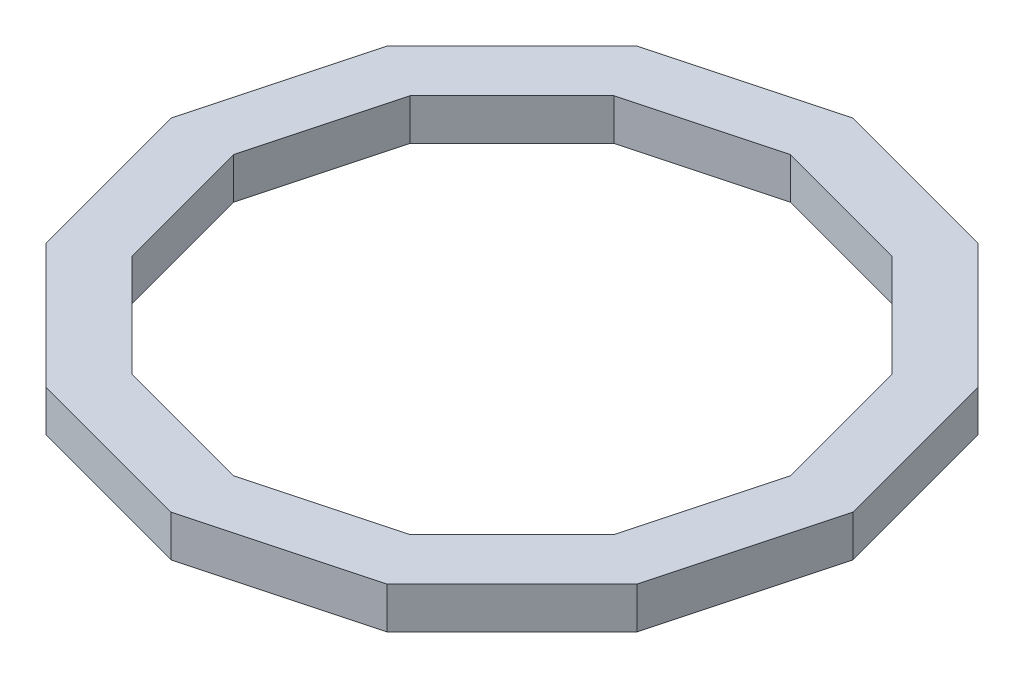
ISO-10303-21;
HEADER;
FILE_DESCRIPTION(('STEP AP214'),'2;1');
FILE_NAME('part.step','',(''),(''),'','','');
FILE_SCHEMA(('AUTOMOTIVE_DESIGN { 1 0 10303 214 1 1 1 1 }'));
ENDSEC;
DATA;
#1=APPLICATION_CONTEXT('core data for automotive mechanical design processes');
#2=APPLICATION_PROTOCOL_DEFINITION('international standard','automotive_design',2000,#1);
#3=PRODUCT_CONTEXT('',#1,'mechanical');
#4=PRODUCT('Part','Part','',(#3));
#5=PRODUCT_RELATED_PRODUCT_CATEGORY('part','',(#4));
#6=PRODUCT_DEFINITION_FORMATION('','',#4);
#7=PRODUCT_DEFINITION_CONTEXT('part definition',#1,'design');
#8=PRODUCT_DEFINITION('design','',#6,#7);
#9=PRODUCT_DEFINITION_SHAPE('','',#8);
#10=(LENGTH_UNIT() NAMED_UNIT(*) SI_UNIT(.MILLI.,.METRE.));
#11=(NAMED_UNIT(*) PLANE_ANGLE_UNIT() SI_UNIT($,.RADIAN.));
#12=(NAMED_UNIT(*) SI_UNIT($,.STERADIAN.) SOLID_ANGLE_UNIT());
#13=UNCERTAINTY_MEASURE_WITH_UNIT(LENGTH_MEASURE(1.E-05),#10,'distance_accuracy_value','');
#14=(GEOMETRIC_REPRESENTATION_CONTEXT(3) GLOBAL_UNCERTAINTY_ASSIGNED_CONTEXT((#13)) GLOBAL_UNIT_ASSIGNED_CONTEXT((#10,
#11,#12)) REPRESENTATION_CONTEXT('',''));
#15=CARTESIAN_POINT('',(0.,0.,0.));
#16=DIRECTION('',(0.,0.,1.));
#17=DIRECTION('',(1.,0.,0.));
#18=AXIS2_PLACEMENT_3D('',#15,#16,#17);
#19=CARTESIAN_POINT('',(0.,19.05,0.));
#20=DIRECTION('',(0.,1.,0.));
#21=DIRECTION('',(0.,0.,1.));
#22=AXIS2_PLACEMENT_3D('',#19,#20,#21);
#23=PLANE('',#22);
#24=DIRECTION('',(-0.258819045102521,0.,0.965925826289068));
#25=VECTOR('',#24,1.);
#26=CARTESIAN_POINT('',(-135.984090335618,19.05,-78.5104511607755));
#27=LINE('',#26,#25);
#28=CARTESIAN_POINT('',(-135.984090335618,19.05,-78.5104511607755));
#29=VERTEX_POINT('',#28);
#30=CARTESIAN_POINT('',(-157.020902321551,19.05,0.));
#31=VERTEX_POINT('',#30);
#32=EDGE_CURVE('E290',#29,#31,#27,.T.);
#33=ORIENTED_EDGE('',*,*,#32,.T.);
#34=DIRECTION('',(0.258819045102521,0.,0.965925826289068));
#35=VECTOR('',#34,1.);
#36=CARTESIAN_POINT('',(-157.020902321551,19.05,0.));
#37=LINE('',#36,#35);
#38=CARTESIAN_POINT('',(-135.984090335618,19.05,78.5104511607754));
#39=VERTEX_POINT('',#38);
#40=EDGE_CURVE('E293',#31,#39,#37,.T.);
#41=ORIENTED_EDGE('',*,*,#40,.T.);
#42=DIRECTION('',(0.707106781186547,0.,0.707106781186548));
#43=VECTOR('',#42,1.);
#44=CARTESIAN_POINT('',(-135.984090335618,19.05,78.5104511607754));
#45=LINE('',#44,#43);
#46=CARTESIAN_POINT('',(-78.5104511607755,19.05,135.984090335618));
#47=VERTEX_POINT('',#46);
#48=EDGE_CURVE('E296',#39,#47,#45,.T.);
#49=ORIENTED_EDGE('',*,*,#48,.T.);
#50=DIRECTION('',(0.965925826289068,0.,0.258819045102521));
#51=VECTOR('',#50,1.);
#52=CARTESIAN_POINT('',(-78.5104511607755,19.05,135.984090335618));
#53=LINE('',#52,#51);
#54=CARTESIAN_POINT('',(0.,19.05,157.020902321551));
#55=VERTEX_POINT('',#54);
#56=EDGE_CURVE('E298',#47,#55,#53,.T.);
#57=ORIENTED_EDGE('',*,*,#56,.T.);
#58=DIRECTION('',(0.965925826289068,0.,-0.258819045102521));
#59=VECTOR('',#58,1.);
#60=CARTESIAN_POINT('',(0.,19.05,157.020902321551));
#61=LINE('',#60,#59);
#62=CARTESIAN_POINT('',(78.5104511607753,19.05,135.984090335618));
#63=VERTEX_POINT('',#62);
#64=EDGE_CURVE('E300',#55,#63,#61,.T.);
#65=ORIENTED_EDGE('',*,*,#64,.T.);
#66=DIRECTION('',(0.707106781186548,0.,-0.707106781186547));
#67=VECTOR('',#66,1.);
#68=CARTESIAN_POINT('',(78.5104511607753,19.05,135.984090335618));
#69=LINE('',#68,#67);
#70=CARTESIAN_POINT('',(135.984090335618,19.05,78.5104511607754));
#71=VERTEX_POINT('',#70);
#72=EDGE_CURVE('E302',#63,#71,#69,.T.);
#73=ORIENTED_EDGE('',*,*,#72,.T.);
#74=DIRECTION('',(0.258819045102521,0.,-0.965925826289068));
#75=VECTOR('',#74,1.);
#76=CARTESIAN_POINT('',(135.984090335618,19.05,78.5104511607754));
#77=LINE('',#76,#75);
#78=CARTESIAN_POINT('',(157.020902321551,19.05,0.));
#79=VERTEX_POINT('',#78);
#80=EDGE_CURVE('E304',#71,#79,#77,.T.);
#81=ORIENTED_EDGE('',*,*,#80,.T.);
#82=DIRECTION('',(-0.25881904510252,0.,-0.965925826289068));
#83=VECTOR('',#82,1.);
#84=CARTESIAN_POINT('',(157.020902321551,19.05,0.));
#85=LINE('',#84,#83);
#86=CARTESIAN_POINT('',(135.984090335618,19.05,-78.5104511607753));
#87=VERTEX_POINT('',#86);
#88=EDGE_CURVE('E306',#79,#87,#85,.T.);
#89=ORIENTED_EDGE('',*,*,#88,.T.);
#90=DIRECTION('',(-0.707106781186547,0.,-0.707106781186548));
#91=VECTOR('',#90,1.);
#92=CARTESIAN_POINT('',(135.984090335618,19.05,-78.5104511607753));
#93=LINE('',#92,#91);
#94=CARTESIAN_POINT('',(78.5104511607753,19.05,-135.984090335618));
#95=VERTEX_POINT('',#94);
#96=EDGE_CURVE('E308',#87,#95,#93,.T.);
#97=ORIENTED_EDGE('',*,*,#96,.T.);
#98=DIRECTION('',(-0.965925826289068,0.,-0.258819045102521));
#99=VECTOR('',#98,1.);
#100=CARTESIAN_POINT('',(78.5104511607753,19.05,-135.984090335618));
#101=LINE('',#100,#99);
#102=CARTESIAN_POINT('',(0.,19.05,-157.020902321551));
#103=VERTEX_POINT('',#102);
#104=EDGE_CURVE('E310',#95,#103,#101,.T.);
#105=ORIENTED_EDGE('',*,*,#104,.T.);
#106=DIRECTION('',(-0.965925826289068,0.,0.25881904510252));
#107=VECTOR('',#106,1.);
#108=CARTESIAN_POINT('',(0.,19.05,-157.020902321551));
#109=LINE('',#108,#107);
#110=CARTESIAN_POINT('',(-78.5104511607752,19.05,-135.984090335618));
#111=VERTEX_POINT('',#110);
#112=EDGE_CURVE('E312',#103,#111,#109,.T.);
#113=ORIENTED_EDGE('',*,*,#112,.T.);
#114=DIRECTION('',(-0.707106781186548,0.,0.707106781186547));
#115=VECTOR('',#114,1.);
#116=CARTESIAN_POINT('',(-78.5104511607752,19.05,-135.984090335618));
#117=LINE('',#116,#115);
#118=EDGE_CURVE('E314',#111,#29,#117,.T.);
#119=ORIENTED_EDGE('',*,*,#118,.T.);
#120=EDGE_LOOP('',(#33,#41,#49,#57,#65,#73,#81,#89,#97,#105,#113,#119));
#121=FACE_BOUND('',#120,.T.);
#122=DIRECTION('',(0.25881904510252,0.,0.965925826289068));
#123=VECTOR('',#122,1.);
#124=CARTESIAN_POINT('',(-128.095285840893,19.05,0.));
#125=LINE('',#124,#123);
#126=CARTESIAN_POINT('',(-128.095285840893,19.05,0.));
#127=VERTEX_POINT('',#126);
#128=CARTESIAN_POINT('',(-110.933771643242,19.05,64.0476429204464));
#129=VERTEX_POINT('',#128);
#130=EDGE_CURVE('E203',#127,#129,#125,.T.);
#131=ORIENTED_EDGE('',*,*,#130,.F.);
#132=DIRECTION('',(-0.258819045102521,0.,0.965925826289068));
#133=VECTOR('',#132,1.);
#134=CARTESIAN_POINT('',(-110.933771643242,19.05,-64.0476429204465));
#135=LINE('',#134,#133);
#136=CARTESIAN_POINT('',(-110.933771643242,19.05,-64.0476429204465));
#137=VERTEX_POINT('',#136);
#138=EDGE_CURVE('E195',#137,#127,#135,.T.);
#139=ORIENTED_EDGE('',*,*,#138,.F.);
#140=DIRECTION('',(-0.707106781186548,0.,0.707106781186547));
#141=VECTOR('',#140,1.);
#142=CARTESIAN_POINT('',(-64.0476429204464,19.05,-110.933771643242));
#143=LINE('',#142,#141);
#144=CARTESIAN_POINT('',(-64.0476429204464,19.05,-110.933771643242));
#145=VERTEX_POINT('',#144);
#146=EDGE_CURVE('E237',#145,#137,#143,.T.);
#147=ORIENTED_EDGE('',*,*,#146,.F.);
#148=DIRECTION('',(-0.965925826289068,0.,0.258819045102521));
#149=VECTOR('',#148,1.);
#150=CARTESIAN_POINT('',(0.,19.05,-128.095285840893));
#151=LINE('',#150,#149);
#152=CARTESIAN_POINT('',(0.,19.05,-128.095285840893));
#153=VERTEX_POINT('',#152);
#154=EDGE_CURVE('E235',#153,#145,#151,.T.);
#155=ORIENTED_EDGE('',*,*,#154,.F.);
#156=DIRECTION('',(-0.965925826289068,0.,-0.258819045102521));
#157=VECTOR('',#156,1.);
#158=CARTESIAN_POINT('',(64.0476429204465,19.05,-110.933771643242));
#159=LINE('',#158,#157);
#160=CARTESIAN_POINT('',(64.0476429204465,19.05,-110.933771643242));
#161=VERTEX_POINT('',#160);
#162=EDGE_CURVE('E233',#161,#153,#159,.T.);
#163=ORIENTED_EDGE('',*,*,#162,.F.);
#164=DIRECTION('',(-0.707106781186547,0.,-0.707106781186548));
#165=VECTOR('',#164,1.);
#166=CARTESIAN_POINT('',(110.933771643242,19.05,-64.0476429204464));
#167=LINE('',#166,#165);
#168=CARTESIAN_POINT('',(110.933771643242,19.05,-64.0476429204464));
#169=VERTEX_POINT('',#168);
#170=EDGE_CURVE('E231',#169,#161,#167,.T.);
#171=ORIENTED_EDGE('',*,*,#170,.F.);
#172=DIRECTION('',(-0.258819045102521,0.,-0.965925826289069));
#173=VECTOR('',#172,1.);
#174=CARTESIAN_POINT('',(128.095285840893,19.05,0.));
#175=LINE('',#174,#173);
#176=CARTESIAN_POINT('',(128.095285840893,19.05,0.));
#177=VERTEX_POINT('',#176);
#178=EDGE_CURVE('E229',#177,#169,#175,.T.);
#179=ORIENTED_EDGE('',*,*,#178,.F.);
#180=DIRECTION('',(0.258819045102521,0.,-0.965925826289068));
#181=VECTOR('',#180,1.);
#182=CARTESIAN_POINT('',(110.933771643242,19.05,64.0476429204465));
#183=LINE('',#182,#181);
#184=CARTESIAN_POINT('',(110.933771643242,19.05,64.0476429204465));
#185=VERTEX_POINT('',#184);
#186=EDGE_CURVE('E227',#185,#177,#183,.T.);
#187=ORIENTED_EDGE('',*,*,#186,.F.);
#188=DIRECTION('',(0.707106781186548,0.,-0.707106781186547));
#189=VECTOR('',#188,1.);
#190=CARTESIAN_POINT('',(64.0476429204464,19.05,110.933771643242));
#191=LINE('',#190,#189);
#192=CARTESIAN_POINT('',(64.0476429204464,19.05,110.933771643242));
#193=VERTEX_POINT('',#192);
#194=EDGE_CURVE('E225',#193,#185,#191,.T.);
#195=ORIENTED_EDGE('',*,*,#194,.F.);
#196=DIRECTION('',(0.965925826289068,0.,-0.258819045102521));
#197=VECTOR('',#196,1.);
#198=CARTESIAN_POINT('',(-1.25003761492327E-13,19.05,128.095285840893));
#199=LINE('',#198,#197);
#200=CARTESIAN_POINT('',(-1.25003761492327E-13,19.05,128.095285840893));
#201=VERTEX_POINT('',#200);
#202=EDGE_CURVE('E222',#201,#193,#199,.T.);
#203=ORIENTED_EDGE('',*,*,#202,.F.);
#204=DIRECTION('',(0.965925826289068,0.,0.258819045102521));
#205=VECTOR('',#204,1.);
#206=CARTESIAN_POINT('',(-64.0476429204465,19.05,110.933771643242));
#207=LINE('',#206,#205);
#208=CARTESIAN_POINT('',(-64.0476429204465,19.05,110.933771643242));
#209=VERTEX_POINT('',#208);
#210=EDGE_CURVE('E218',#209,#201,#207,.T.);
#211=ORIENTED_EDGE('',*,*,#210,.F.);
#212=DIRECTION('',(0.707106781186547,0.,0.707106781186548));
#213=VECTOR('',#212,1.);
#214=CARTESIAN_POINT('',(-110.933771643242,19.05,64.0476429204464));
#215=LINE('',#214,#213);
#216=EDGE_CURVE('E216',#129,#209,#215,.T.);
#217=ORIENTED_EDGE('',*,*,#216,.F.);
#218=EDGE_LOOP('',(#131,#139,#147,#155,#163,#171,#179,#187,#195,#203,#211,#217));
#219=FACE_BOUND('',#218,.T.);
#220=ADVANCED_FACE('F34',(#121,#219),#23,.T.);
#221=CARTESIAN_POINT('',(0.,0.,0.));
#222=DIRECTION('',(0.,1.,0.));
#223=DIRECTION('',(0.,0.,1.));
#224=AXIS2_PLACEMENT_3D('',#221,#222,#223);
#225=PLANE('',#224);
#226=DIRECTION('',(-0.258819045102521,0.,0.965925826289068));
#227=VECTOR('',#226,1.);
#228=CARTESIAN_POINT('',(-135.984090335618,0.,-78.5104511607755));
#229=LINE('',#228,#227);
#230=CARTESIAN_POINT('',(-135.984090335618,0.,-78.5104511607755));
#231=VERTEX_POINT('',#230);
#232=CARTESIAN_POINT('',(-157.020902321551,0.,0.));
#233=VERTEX_POINT('',#232);
#234=EDGE_CURVE('E211',#231,#233,#229,.T.);
#235=ORIENTED_EDGE('',*,*,#234,.F.);
#236=DIRECTION('',(-0.707106781186548,0.,0.707106781186547));
#237=VECTOR('',#236,1.);
#238=CARTESIAN_POINT('',(-78.5104511607752,0.,-135.984090335618));
#239=LINE('',#238,#237);
#240=CARTESIAN_POINT('',(-78.5104511607752,0.,-135.984090335618));
#241=VERTEX_POINT('',#240);
#242=EDGE_CURVE('E294',#241,#231,#239,.T.);
#243=ORIENTED_EDGE('',*,*,#242,.F.);
#244=DIRECTION('',(-0.965925826289068,0.,0.25881904510252));
#245=VECTOR('',#244,1.);
#246=CARTESIAN_POINT('',(0.,0.,-157.020902321551));
#247=LINE('',#246,#245);
#248=CARTESIAN_POINT('',(0.,0.,-157.020902321551));
#249=VERTEX_POINT('',#248);
#250=EDGE_CURVE('E337',#249,#241,#247,.T.);
#251=ORIENTED_EDGE('',*,*,#250,.F.);
#252=DIRECTION('',(-0.965925826289068,0.,-0.258819045102521));
#253=VECTOR('',#252,1.);
#254=CARTESIAN_POINT('',(78.5104511607753,0.,-135.984090335618));
#255=LINE('',#254,#253);
#256=CARTESIAN_POINT('',(78.5104511607753,0.,-135.984090335618));
#257=VERTEX_POINT('',#256);
#258=EDGE_CURVE('E335',#257,#249,#255,.T.);
#259=ORIENTED_EDGE('',*,*,#258,.F.);
#260=DIRECTION('',(-0.707106781186547,0.,-0.707106781186548));
#261=VECTOR('',#260,1.);
#262=CARTESIAN_POINT('',(135.984090335618,0.,-78.5104511607753));
#263=LINE('',#262,#261);
#264=CARTESIAN_POINT('',(135.984090335618,0.,-78.5104511607753));
#265=VERTEX_POINT('',#264);
#266=EDGE_CURVE('E333',#265,#257,#263,.T.);
#267=ORIENTED_EDGE('',*,*,#266,.F.);
#268=DIRECTION('',(-0.25881904510252,0.,-0.965925826289068));
#269=VECTOR('',#268,1.);
#270=CARTESIAN_POINT('',(157.020902321551,0.,0.));
#271=LINE('',#270,#269);
#272=CARTESIAN_POINT('',(157.020902321551,0.,0.));
#273=VERTEX_POINT('',#272);
#274=EDGE_CURVE('E331',#273,#265,#271,.T.);
#275=ORIENTED_EDGE('',*,*,#274,.F.);
#276=DIRECTION('',(0.258819045102521,0.,-0.965925826289068));
#277=VECTOR('',#276,1.);
#278=CARTESIAN_POINT('',(135.984090335618,0.,78.5104511607754));
#279=LINE('',#278,#277);
#280=CARTESIAN_POINT('',(135.984090335618,0.,78.5104511607754));
#281=VERTEX_POINT('',#280);
#282=EDGE_CURVE('E329',#281,#273,#279,.T.);
#283=ORIENTED_EDGE('',*,*,#282,.F.);
#284=DIRECTION('',(0.707106781186548,0.,-0.707106781186547));
#285=VECTOR('',#284,1.);
#286=CARTESIAN_POINT('',(78.5104511607753,0.,135.984090335618));
#287=LINE('',#286,#285);
#288=CARTESIAN_POINT('',(78.5104511607753,0.,135.984090335618));
#289=VERTEX_POINT('',#288);
#290=EDGE_CURVE('E327',#289,#281,#287,.T.);
#291=ORIENTED_EDGE('',*,*,#290,.F.);
#292=DIRECTION('',(0.965925826289068,0.,-0.258819045102521));
#293=VECTOR('',#292,1.);
#294=CARTESIAN_POINT('',(0.,0.,157.020902321551));
#295=LINE('',#294,#293);
#296=CARTESIAN_POINT('',(0.,0.,157.020902321551));
#297=VERTEX_POINT('',#296);
#298=EDGE_CURVE('E325',#297,#289,#295,.T.);
#299=ORIENTED_EDGE('',*,*,#298,.F.);
#300=DIRECTION('',(0.965925826289068,0.,0.258819045102521));
#301=VECTOR('',#300,1.);
#302=CARTESIAN_POINT('',(-78.5104511607755,0.,135.984090335618));
#303=LINE('',#302,#301);
#304=CARTESIAN_POINT('',(-78.5104511607755,0.,135.984090335618));
#305=VERTEX_POINT('',#304);
#306=EDGE_CURVE('E323',#305,#297,#303,.T.);
#307=ORIENTED_EDGE('',*,*,#306,.F.);
#308=DIRECTION('',(0.707106781186547,0.,0.707106781186548));
#309=VECTOR('',#308,1.);
#310=CARTESIAN_POINT('',(-135.984090335618,0.,78.5104511607754));
#311=LINE('',#310,#309);
#312=CARTESIAN_POINT('',(-135.984090335618,0.,78.5104511607754));
#313=VERTEX_POINT('',#312);
#314=EDGE_CURVE('E321',#313,#305,#311,.T.);
#315=ORIENTED_EDGE('',*,*,#314,.F.);
#316=DIRECTION('',(0.258819045102521,0.,0.965925826289068));
#317=VECTOR('',#316,1.);
#318=CARTESIAN_POINT('',(-157.020902321551,0.,0.));
#319=LINE('',#318,#317);
#320=EDGE_CURVE('E319',#233,#313,#319,.T.);
#321=ORIENTED_EDGE('',*,*,#320,.F.);
#322=EDGE_LOOP('',(#235,#243,#251,#259,#267,#275,#283,#291,#299,#307,#315,#321));
#323=FACE_BOUND('',#322,.T.);
#324=DIRECTION('',(-0.258819045102521,0.,0.965925826289068));
#325=VECTOR('',#324,1.);
#326=CARTESIAN_POINT('',(-110.933771643242,0.,-64.0476429204465));
#327=LINE('',#326,#325);
#328=CARTESIAN_POINT('',(-110.933771643242,0.,-64.0476429204465));
#329=VERTEX_POINT('',#328);
#330=CARTESIAN_POINT('',(-128.095285840893,0.,0.));
#331=VERTEX_POINT('',#330);
#332=EDGE_CURVE('E57',#329,#331,#327,.T.);
#333=ORIENTED_EDGE('',*,*,#332,.T.);
#334=DIRECTION('',(0.25881904510252,0.,0.965925826289068));
#335=VECTOR('',#334,1.);
#336=CARTESIAN_POINT('',(-128.095285840893,0.,0.));
#337=LINE('',#336,#335);
#338=CARTESIAN_POINT('',(-110.933771643242,0.,64.0476429204464));
#339=VERTEX_POINT('',#338);
#340=EDGE_CURVE('E210',#331,#339,#337,.T.);
#341=ORIENTED_EDGE('',*,*,#340,.T.);
#342=DIRECTION('',(0.707106781186547,0.,0.707106781186548));
#343=VECTOR('',#342,1.);
#344=CARTESIAN_POINT('',(-110.933771643242,0.,64.0476429204464));
#345=LINE('',#344,#343);
#346=CARTESIAN_POINT('',(-64.0476429204465,0.,110.933771643242));
#347=VERTEX_POINT('',#346);
#348=EDGE_CURVE('E241',#339,#347,#345,.T.);
#349=ORIENTED_EDGE('',*,*,#348,.T.);
#350=DIRECTION('',(0.965925826289068,0.,0.258819045102521));
#351=VECTOR('',#350,1.);
#352=CARTESIAN_POINT('',(-64.0476429204465,0.,110.933771643242));
#353=LINE('',#352,#351);
#354=CARTESIAN_POINT('',(-1.25003761492327E-13,0.,128.095285840893));
#355=VERTEX_POINT('',#354);
#356=EDGE_CURVE('E244',#347,#355,#353,.T.);
#357=ORIENTED_EDGE('',*,*,#356,.T.);
#358=DIRECTION('',(0.965925826289068,0.,-0.258819045102521));
#359=VECTOR('',#358,1.);
#360=CARTESIAN_POINT('',(-1.25003761492327E-13,0.,128.095285840893));
#361=LINE('',#360,#359);
#362=CARTESIAN_POINT('',(64.0476429204464,0.,110.933771643242));
#363=VERTEX_POINT('',#362);
#364=EDGE_CURVE('E247',#355,#363,#361,.T.);
#365=ORIENTED_EDGE('',*,*,#364,.T.);
#366=DIRECTION('',(0.707106781186548,0.,-0.707106781186547));
#367=VECTOR('',#366,1.);
#368=CARTESIAN_POINT('',(64.0476429204464,0.,110.933771643242));
#369=LINE('',#368,#367);
#370=CARTESIAN_POINT('',(110.933771643242,0.,64.0476429204465));
#371=VERTEX_POINT('',#370);
#372=EDGE_CURVE('E251',#363,#371,#369,.T.);
#373=ORIENTED_EDGE('',*,*,#372,.T.);
#374=DIRECTION('',(0.258819045102521,0.,-0.965925826289068));
#375=VECTOR('',#374,1.);
#376=CARTESIAN_POINT('',(110.933771643242,0.,64.0476429204465));
#377=LINE('',#376,#375);
#378=CARTESIAN_POINT('',(128.095285840893,0.,0.));
#379=VERTEX_POINT('',#378);
#380=EDGE_CURVE('E254',#371,#379,#377,.T.);
#381=ORIENTED_EDGE('',*,*,#380,.T.);
#382=DIRECTION('',(-0.258819045102521,0.,-0.965925826289069));
#383=VECTOR('',#382,1.);
#384=CARTESIAN_POINT('',(128.095285840893,0.,0.));
#385=LINE('',#384,#383);
#386=CARTESIAN_POINT('',(110.933771643242,0.,-64.0476429204464));
#387=VERTEX_POINT('',#386);
#388=EDGE_CURVE('E257',#379,#387,#385,.T.);
#389=ORIENTED_EDGE('',*,*,#388,.T.);
#390=DIRECTION('',(-0.707106781186547,0.,-0.707106781186548));
#391=VECTOR('',#390,1.);
#392=CARTESIAN_POINT('',(110.933771643242,0.,-64.0476429204464));
#393=LINE('',#392,#391);
#394=CARTESIAN_POINT('',(64.0476429204465,0.,-110.933771643242));
#395=VERTEX_POINT('',#394);
#396=EDGE_CURVE('E260',#387,#395,#393,.T.);
#397=ORIENTED_EDGE('',*,*,#396,.T.);
#398=DIRECTION('',(-0.965925826289068,0.,-0.258819045102521));
#399=VECTOR('',#398,1.);
#400=CARTESIAN_POINT('',(64.0476429204465,0.,-110.933771643242));
#401=LINE('',#400,#399);
#402=CARTESIAN_POINT('',(0.,0.,-128.095285840893));
#403=VERTEX_POINT('',#402);
#404=EDGE_CURVE('E263',#395,#403,#401,.T.);
#405=ORIENTED_EDGE('',*,*,#404,.T.);
#406=DIRECTION('',(-0.965925826289068,0.,0.258819045102521));
#407=VECTOR('',#406,1.);
#408=CARTESIAN_POINT('',(0.,0.,-128.095285840893));
#409=LINE('',#408,#407);
#410=CARTESIAN_POINT('',(-64.0476429204464,0.,-110.933771643242));
#411=VERTEX_POINT('',#410);
#412=EDGE_CURVE('E266',#403,#411,#409,.T.);
#413=ORIENTED_EDGE('',*,*,#412,.T.);
#414=DIRECTION('',(-0.707106781186548,0.,0.707106781186547));
#415=VECTOR('',#414,1.);
#416=CARTESIAN_POINT('',(-64.0476429204464,0.,-110.933771643242));
#417=LINE('',#416,#415);
#418=EDGE_CURVE('E204',#411,#329,#417,.T.);
#419=ORIENTED_EDGE('',*,*,#418,.T.);
#420=EDGE_LOOP('',(#333,#341,#349,#357,#365,#373,#381,#389,#397,#405,#413,#419));
#421=FACE_BOUND('',#420,.T.);
#422=ADVANCED_FACE('F379',(#323,#421),#225,.F.);
#423=CARTESIAN_POINT('',(-135.984090335618,19.05,-78.5104511607755));
#424=DIRECTION('',(0.965925826289068,0.,0.258819045102521));
#425=DIRECTION('',(0.258819045102521,0.,-0.965925826289068));
#426=AXIS2_PLACEMENT_3D('',#423,#424,#425);
#427=PLANE('',#426);
#428=ORIENTED_EDGE('',*,*,#234,.T.);
#429=DIRECTION('',(0.,-1.,0.));
#430=VECTOR('',#429,1.);
#431=CARTESIAN_POINT('',(-157.020902321551,19.05,0.));
#432=LINE('',#431,#430);
#433=EDGE_CURVE('E11',#31,#233,#432,.T.);
#434=ORIENTED_EDGE('',*,*,#433,.F.);
#435=ORIENTED_EDGE('',*,*,#32,.F.);
#436=DIRECTION('',(0.,-1.,0.));
#437=VECTOR('',#436,1.);
#438=CARTESIAN_POINT('',(-135.984090335618,19.05,-78.5104511607755));
#439=LINE('',#438,#437);
#440=EDGE_CURVE('E316',#29,#231,#439,.T.);
#441=ORIENTED_EDGE('',*,*,#440,.T.);
#442=EDGE_LOOP('',(#428,#434,#435,#441));
#443=FACE_BOUND('',#442,.T.);
#444=ADVANCED_FACE('F36',(#443),#427,.F.);
#445=CARTESIAN_POINT('',(-157.020902321551,19.05,0.));
#446=DIRECTION('',(0.965925826289068,0.,-0.258819045102521));
#447=DIRECTION('',(-0.258819045102521,0.,-0.965925826289068));
#448=AXIS2_PLACEMENT_3D('',#445,#446,#447);
#449=PLANE('',#448);
#450=ORIENTED_EDGE('',*,*,#320,.T.);
#451=DIRECTION('',(0.,-1.,0.));
#452=VECTOR('',#451,1.);
#453=CARTESIAN_POINT('',(-135.984090335618,19.05,78.5104511607754));
#454=LINE('',#453,#452);
#455=EDGE_CURVE('E42',#39,#313,#454,.T.);
#456=ORIENTED_EDGE('',*,*,#455,.F.);
#457=ORIENTED_EDGE('',*,*,#40,.F.);
#458=ORIENTED_EDGE('',*,*,#433,.T.);
#459=EDGE_LOOP('',(#450,#456,#457,#458));
#460=FACE_BOUND('',#459,.T.);
#461=ADVANCED_FACE('F396',(#460),#449,.F.);
#462=CARTESIAN_POINT('',(-135.984090335618,19.05,78.5104511607754));
#463=DIRECTION('',(0.707106781186548,0.,-0.707106781186547));
#464=DIRECTION('',(-0.707106781186547,0.,-0.707106781186548));
#465=AXIS2_PLACEMENT_3D('',#462,#463,#464);
#466=PLANE('',#465);
#467=ORIENTED_EDGE('',*,*,#314,.T.);
#468=DIRECTION('',(0.,-1.,0.));
#469=VECTOR('',#468,1.);
#470=CARTESIAN_POINT('',(-78.5104511607755,19.05,135.984090335618));
#471=LINE('',#470,#469);
#472=EDGE_CURVE('E366',#47,#305,#471,.T.);
#473=ORIENTED_EDGE('',*,*,#472,.F.);
#474=ORIENTED_EDGE('',*,*,#48,.F.);
#475=ORIENTED_EDGE('',*,*,#455,.T.);
#476=EDGE_LOOP('',(#467,#473,#474,#475));
#477=FACE_BOUND('',#476,.T.);
#478=ADVANCED_FACE('F373',(#477),#466,.F.);
#479=CARTESIAN_POINT('',(-78.5104511607755,19.05,135.984090335618));
#480=DIRECTION('',(0.258819045102521,0.,-0.965925826289068));
#481=DIRECTION('',(-0.965925826289068,0.,-0.258819045102521));
#482=AXIS2_PLACEMENT_3D('',#479,#480,#481);
#483=PLANE('',#482);
#484=ORIENTED_EDGE('',*,*,#306,.T.);
#485=DIRECTION('',(0.,-1.,0.));
#486=VECTOR('',#485,1.);
#487=CARTESIAN_POINT('',(0.,19.05,157.020902321551));
#488=LINE('',#487,#486);
#489=EDGE_CURVE('E363',#55,#297,#488,.T.);
#490=ORIENTED_EDGE('',*,*,#489,.F.);
#491=ORIENTED_EDGE('',*,*,#56,.F.);
#492=ORIENTED_EDGE('',*,*,#472,.T.);
#493=EDGE_LOOP('',(#484,#490,#491,#492));
#494=FACE_BOUND('',#493,.T.);
#495=ADVANCED_FACE('F385',(#494),#483,.F.);
#496=CARTESIAN_POINT('',(0.,19.05,157.020902321551));
#497=DIRECTION('',(-0.258819045102521,0.,-0.965925826289068));
#498=DIRECTION('',(-0.965925826289068,0.,0.258819045102521));
#499=AXIS2_PLACEMENT_3D('',#496,#497,#498);
#500=PLANE('',#499);
#501=ORIENTED_EDGE('',*,*,#298,.T.);
#502=DIRECTION('',(0.,-1.,0.));
#503=VECTOR('',#502,1.);
#504=CARTESIAN_POINT('',(78.5104511607753,19.05,135.984090335618));
#505=LINE('',#504,#503);
#506=EDGE_CURVE('E360',#63,#289,#505,.T.);
#507=ORIENTED_EDGE('',*,*,#506,.F.);
#508=ORIENTED_EDGE('',*,*,#64,.F.);
#509=ORIENTED_EDGE('',*,*,#489,.T.);
#510=EDGE_LOOP('',(#501,#507,#508,#509));
#511=FACE_BOUND('',#510,.T.);
#512=ADVANCED_FACE('F389',(#511),#500,.F.);
#513=CARTESIAN_POINT('',(78.5104511607753,19.05,135.984090335618));
#514=DIRECTION('',(-0.707106781186547,0.,-0.707106781186548));
#515=DIRECTION('',(-0.707106781186548,0.,0.707106781186547));
#516=AXIS2_PLACEMENT_3D('',#513,#514,#515);
#517=PLANE('',#516);
#518=ORIENTED_EDGE('',*,*,#290,.T.);
#519=DIRECTION('',(0.,-1.,0.));
#520=VECTOR('',#519,1.);
#521=CARTESIAN_POINT('',(135.984090335618,19.05,78.5104511607754));
#522=LINE('',#521,#520);
#523=EDGE_CURVE('E357',#71,#281,#522,.T.);
#524=ORIENTED_EDGE('',*,*,#523,.F.);
#525=ORIENTED_EDGE('',*,*,#72,.F.);
#526=ORIENTED_EDGE('',*,*,#506,.T.);
#527=EDGE_LOOP('',(#518,#524,#525,#526));
#528=FACE_BOUND('',#527,.T.);
#529=ADVANCED_FACE('F429',(#528),#517,.F.);
#530=CARTESIAN_POINT('',(135.984090335618,19.05,78.5104511607754));
#531=DIRECTION('',(-0.965925826289068,0.,-0.258819045102521));
#532=DIRECTION('',(-0.258819045102521,0.,0.965925826289068));
#533=AXIS2_PLACEMENT_3D('',#530,#531,#532);
#534=PLANE('',#533);
#535=ORIENTED_EDGE('',*,*,#282,.T.);
#536=DIRECTION('',(0.,-1.,0.));
#537=VECTOR('',#536,1.);
#538=CARTESIAN_POINT('',(157.020902321551,19.05,0.));
#539=LINE('',#538,#537);
#540=EDGE_CURVE('E354',#79,#273,#539,.T.);
#541=ORIENTED_EDGE('',*,*,#540,.F.);
#542=ORIENTED_EDGE('',*,*,#80,.F.);
#543=ORIENTED_EDGE('',*,*,#523,.T.);
#544=EDGE_LOOP('',(#535,#541,#542,#543));
#545=FACE_BOUND('',#544,.T.);
#546=ADVANCED_FACE('F427',(#545),#534,.F.);
#547=CARTESIAN_POINT('',(157.020902321551,19.05,0.));
#548=DIRECTION('',(-0.965925826289068,0.,0.25881904510252));
#549=DIRECTION('',(0.25881904510252,0.,0.965925826289068));
#550=AXIS2_PLACEMENT_3D('',#547,#548,#549);
#551=PLANE('',#550);
#552=ORIENTED_EDGE('',*,*,#274,.T.);
#553=DIRECTION('',(0.,-1.,0.));
#554=VECTOR('',#553,1.);
#555=CARTESIAN_POINT('',(135.984090335618,19.05,-78.5104511607753));
#556=LINE('',#555,#554);
#557=EDGE_CURVE('E351',#87,#265,#556,.T.);
#558=ORIENTED_EDGE('',*,*,#557,.F.);
#559=ORIENTED_EDGE('',*,*,#88,.F.);
#560=ORIENTED_EDGE('',*,*,#540,.T.);
#561=EDGE_LOOP('',(#552,#558,#559,#560));
#562=FACE_BOUND('',#561,.T.);
#563=ADVANCED_FACE('F423',(#562),#551,.F.);
#564=CARTESIAN_POINT('',(135.984090335618,19.05,-78.5104511607753));
#565=DIRECTION('',(-0.707106781186548,0.,0.707106781186547));
#566=DIRECTION('',(0.707106781186547,0.,0.707106781186548));
#567=AXIS2_PLACEMENT_3D('',#564,#565,#566);
#568=PLANE('',#567);
#569=ORIENTED_EDGE('',*,*,#266,.T.);
#570=DIRECTION('',(0.,-1.,0.));
#571=VECTOR('',#570,1.);
#572=CARTESIAN_POINT('',(78.5104511607753,19.05,-135.984090335618));
#573=LINE('',#572,#571);
#574=EDGE_CURVE('E348',#95,#257,#573,.T.);
#575=ORIENTED_EDGE('',*,*,#574,.F.);
#576=ORIENTED_EDGE('',*,*,#96,.F.);
#577=ORIENTED_EDGE('',*,*,#557,.T.);
#578=EDGE_LOOP('',(#569,#575,#576,#577));
#579=FACE_BOUND('',#578,.T.);
#580=ADVANCED_FACE('F418',(#579),#568,.F.);
#581=CARTESIAN_POINT('',(78.5104511607753,19.05,-135.984090335618));
#582=DIRECTION('',(-0.258819045102521,0.,0.965925826289068));
#583=DIRECTION('',(0.965925826289068,0.,0.258819045102521));
#584=AXIS2_PLACEMENT_3D('',#581,#582,#583);
#585=PLANE('',#584);
#586=ORIENTED_EDGE('',*,*,#258,.T.);
#587=DIRECTION('',(0.,-1.,0.));
#588=VECTOR('',#587,1.);
#589=CARTESIAN_POINT('',(0.,19.05,-157.020902321551));
#590=LINE('',#589,#588);
#591=EDGE_CURVE('E345',#103,#249,#590,.T.);
#592=ORIENTED_EDGE('',*,*,#591,.F.);
#593=ORIENTED_EDGE('',*,*,#104,.F.);
#594=ORIENTED_EDGE('',*,*,#574,.T.);
#595=EDGE_LOOP('',(#586,#592,#593,#594));
#596=FACE_BOUND('',#595,.T.);
#597=ADVANCED_FACE('F412',(#596),#585,.F.);
#598=CARTESIAN_POINT('',(0.,19.05,-157.020902321551));
#599=DIRECTION('',(0.25881904510252,0.,0.965925826289068));
#600=DIRECTION('',(0.965925826289069,0.,-0.25881904510252));
#601=AXIS2_PLACEMENT_3D('',#598,#599,#600);
#602=PLANE('',#601);
#603=ORIENTED_EDGE('',*,*,#250,.T.);
#604=DIRECTION('',(0.,-1.,0.));
#605=VECTOR('',#604,1.);
#606=CARTESIAN_POINT('',(-78.5104511607752,19.05,-135.984090335618));
#607=LINE('',#606,#605);
#608=EDGE_CURVE('E342',#111,#241,#607,.T.);
#609=ORIENTED_EDGE('',*,*,#608,.F.);
#610=ORIENTED_EDGE('',*,*,#112,.F.);
#611=ORIENTED_EDGE('',*,*,#591,.T.);
#612=EDGE_LOOP('',(#603,#609,#610,#611));
#613=FACE_BOUND('',#612,.T.);
#614=ADVANCED_FACE('F408',(#613),#602,.F.);
#615=CARTESIAN_POINT('',(-78.5104511607752,19.05,-135.984090335618));
#616=DIRECTION('',(0.707106781186547,0.,0.707106781186548));
#617=DIRECTION('',(0.707106781186548,0.,-0.707106781186547));
#618=AXIS2_PLACEMENT_3D('',#615,#616,#617);
#619=PLANE('',#618);
#620=ORIENTED_EDGE('',*,*,#242,.T.);
#621=ORIENTED_EDGE('',*,*,#440,.F.);
#622=ORIENTED_EDGE('',*,*,#118,.F.);
#623=ORIENTED_EDGE('',*,*,#608,.T.);
#624=EDGE_LOOP('',(#620,#621,#622,#623));
#625=FACE_BOUND('',#624,.T.);
#626=ADVANCED_FACE('F403',(#625),#619,.F.);
#627=CARTESIAN_POINT('',(-110.933771643242,19.05,-64.0476429204465));
#628=DIRECTION('',(0.965925826289068,0.,0.258819045102521));
#629=DIRECTION('',(0.258819045102521,0.,-0.965925826289068));
#630=AXIS2_PLACEMENT_3D('',#627,#628,#629);
#631=PLANE('',#630);
#632=ORIENTED_EDGE('',*,*,#332,.F.);
#633=DIRECTION('',(0.,-1.,0.));
#634=VECTOR('',#633,1.);
#635=CARTESIAN_POINT('',(-110.933771643242,19.05,-64.0476429204465));
#636=LINE('',#635,#634);
#637=EDGE_CURVE('E199',#137,#329,#636,.T.);
#638=ORIENTED_EDGE('',*,*,#637,.F.);
#639=ORIENTED_EDGE('',*,*,#138,.T.);
#640=DIRECTION('',(0.,-1.,0.));
#641=VECTOR('',#640,1.);
#642=CARTESIAN_POINT('',(-128.095285840893,19.05,0.));
#643=LINE('',#642,#641);
#644=EDGE_CURVE('E198',#127,#331,#643,.T.);
#645=ORIENTED_EDGE('',*,*,#644,.T.);
#646=EDGE_LOOP('',(#632,#638,#639,#645));
#647=FACE_BOUND('',#646,.T.);
#648=ADVANCED_FACE('F197',(#647),#631,.T.);
#649=CARTESIAN_POINT('',(-128.095285840893,19.05,0.));
#650=DIRECTION('',(0.965925826289068,0.,-0.25881904510252));
#651=DIRECTION('',(-0.25881904510252,0.,-0.965925826289069));
#652=AXIS2_PLACEMENT_3D('',#649,#650,#651);
#653=PLANE('',#652);
#654=ORIENTED_EDGE('',*,*,#340,.F.);
#655=ORIENTED_EDGE('',*,*,#644,.F.);
#656=ORIENTED_EDGE('',*,*,#130,.T.);
#657=DIRECTION('',(0.,-1.,0.));
#658=VECTOR('',#657,1.);
#659=CARTESIAN_POINT('',(-110.933771643242,19.05,64.0476429204464));
#660=LINE('',#659,#658);
#661=EDGE_CURVE('E212',#129,#339,#660,.T.);
#662=ORIENTED_EDGE('',*,*,#661,.T.);
#663=EDGE_LOOP('',(#654,#655,#656,#662));
#664=FACE_BOUND('',#663,.T.);
#665=ADVANCED_FACE('F207',(#664),#653,.T.);
#666=CARTESIAN_POINT('',(-110.933771643242,19.05,64.0476429204464));
#667=DIRECTION('',(0.707106781186548,0.,-0.707106781186547));
#668=DIRECTION('',(-0.707106781186547,0.,-0.707106781186548));
#669=AXIS2_PLACEMENT_3D('',#666,#667,#668);
#670=PLANE('',#669);
#671=ORIENTED_EDGE('',*,*,#348,.F.);
#672=ORIENTED_EDGE('',*,*,#661,.F.);
#673=ORIENTED_EDGE('',*,*,#216,.T.);
#674=DIRECTION('',(0.,-1.,0.));
#675=VECTOR('',#674,1.);
#676=CARTESIAN_POINT('',(-64.0476429204465,19.05,110.933771643242));
#677=LINE('',#676,#675);
#678=EDGE_CURVE('E287',#209,#347,#677,.T.);
#679=ORIENTED_EDGE('',*,*,#678,.T.);
#680=EDGE_LOOP('',(#671,#672,#673,#679));
#681=FACE_BOUND('',#680,.T.);
#682=ADVANCED_FACE('F487',(#681),#670,.T.);
#683=CARTESIAN_POINT('',(-64.0476429204465,19.05,110.933771643242));
#684=DIRECTION('',(0.258819045102521,0.,-0.965925826289068));
#685=DIRECTION('',(-0.965925826289068,0.,-0.258819045102521));
#686=AXIS2_PLACEMENT_3D('',#683,#684,#685);
#687=PLANE('',#686);
#688=ORIENTED_EDGE('',*,*,#356,.F.);
#689=ORIENTED_EDGE('',*,*,#678,.F.);
#690=ORIENTED_EDGE('',*,*,#210,.T.);
#691=DIRECTION('',(0.,-1.,0.));
#692=VECTOR('',#691,1.);
#693=CARTESIAN_POINT('',(-1.25003761492327E-13,19.05,128.095285840893));
#694=LINE('',#693,#692);
#695=EDGE_CURVE('E285',#201,#355,#694,.T.);
#696=ORIENTED_EDGE('',*,*,#695,.T.);
#697=EDGE_LOOP('',(#688,#689,#690,#696));
#698=FACE_BOUND('',#697,.T.);
#699=ADVANCED_FACE('F493',(#698),#687,.T.);
#700=CARTESIAN_POINT('',(-1.25003761492327E-13,19.05,128.095285840893));
#701=DIRECTION('',(-0.258819045102521,0.,-0.965925826289068));
#702=DIRECTION('',(-0.965925826289068,0.,0.258819045102521));
#703=AXIS2_PLACEMENT_3D('',#700,#701,#702);
#704=PLANE('',#703);
#705=ORIENTED_EDGE('',*,*,#364,.F.);
#706=ORIENTED_EDGE('',*,*,#695,.F.);
#707=ORIENTED_EDGE('',*,*,#202,.T.);
#708=DIRECTION('',(0.,-1.,0.));
#709=VECTOR('',#708,1.);
#710=CARTESIAN_POINT('',(64.0476429204464,19.05,110.933771643242));
#711=LINE('',#710,#709);
#712=EDGE_CURVE('E283',#193,#363,#711,.T.);
#713=ORIENTED_EDGE('',*,*,#712,.T.);
#714=EDGE_LOOP('',(#705,#706,#707,#713));
#715=FACE_BOUND('',#714,.T.);
#716=ADVANCED_FACE('F501',(#715),#704,.T.);
#717=CARTESIAN_POINT('',(64.0476429204464,19.05,110.933771643242));
#718=DIRECTION('',(-0.707106781186547,0.,-0.707106781186548));
#719=DIRECTION('',(-0.707106781186548,0.,0.707106781186547));
#720=AXIS2_PLACEMENT_3D('',#717,#718,#719);
#721=PLANE('',#720);
#722=ORIENTED_EDGE('',*,*,#372,.F.);
#723=ORIENTED_EDGE('',*,*,#712,.F.);
#724=ORIENTED_EDGE('',*,*,#194,.T.);
#725=DIRECTION('',(0.,-1.,0.));
#726=VECTOR('',#725,1.);
#727=CARTESIAN_POINT('',(110.933771643242,19.05,64.0476429204465));
#728=LINE('',#727,#726);
#729=EDGE_CURVE('E281',#185,#371,#728,.T.);
#730=ORIENTED_EDGE('',*,*,#729,.T.);
#731=EDGE_LOOP('',(#722,#723,#724,#730));
#732=FACE_BOUND('',#731,.T.);
#733=ADVANCED_FACE('F509',(#732),#721,.T.);
#734=CARTESIAN_POINT('',(110.933771643242,19.05,64.0476429204465));
#735=DIRECTION('',(-0.965925826289068,0.,-0.258819045102521));
#736=DIRECTION('',(-0.258819045102521,0.,0.965925826289068));
#737=AXIS2_PLACEMENT_3D('',#734,#735,#736);
#738=PLANE('',#737);
#739=ORIENTED_EDGE('',*,*,#380,.F.);
#740=ORIENTED_EDGE('',*,*,#729,.F.);
#741=ORIENTED_EDGE('',*,*,#186,.T.);
#742=DIRECTION('',(0.,-1.,0.));
#743=VECTOR('',#742,1.);
#744=CARTESIAN_POINT('',(128.095285840893,19.05,0.));
#745=LINE('',#744,#743);
#746=EDGE_CURVE('E279',#177,#379,#745,.T.);
#747=ORIENTED_EDGE('',*,*,#746,.T.);
#748=EDGE_LOOP('',(#739,#740,#741,#747));
#749=FACE_BOUND('',#748,.T.);
#750=ADVANCED_FACE('F517',(#749),#738,.T.);
#751=CARTESIAN_POINT('',(128.095285840893,19.05,0.));
#752=DIRECTION('',(-0.965925826289068,0.,0.258819045102521));
#753=DIRECTION('',(0.258819045102521,0.,0.965925826289068));
#754=AXIS2_PLACEMENT_3D('',#751,#752,#753);
#755=PLANE('',#754);
#756=ORIENTED_EDGE('',*,*,#388,.F.);
#757=ORIENTED_EDGE('',*,*,#746,.F.);
#758=ORIENTED_EDGE('',*,*,#178,.T.);
#759=DIRECTION('',(0.,-1.,0.));
#760=VECTOR('',#759,1.);
#761=CARTESIAN_POINT('',(110.933771643242,19.05,-64.0476429204464));
#762=LINE('',#761,#760);
#763=EDGE_CURVE('E277',#169,#387,#762,.T.);
#764=ORIENTED_EDGE('',*,*,#763,.T.);
#765=EDGE_LOOP('',(#756,#757,#758,#764));
#766=FACE_BOUND('',#765,.T.);
#767=ADVANCED_FACE('F525',(#766),#755,.T.);
#768=CARTESIAN_POINT('',(110.933771643242,19.05,-64.0476429204464));
#769=DIRECTION('',(-0.707106781186548,0.,0.707106781186547));
#770=DIRECTION('',(0.707106781186547,0.,0.707106781186548));
#771=AXIS2_PLACEMENT_3D('',#768,#769,#770);
#772=PLANE('',#771);
#773=ORIENTED_EDGE('',*,*,#396,.F.);
#774=ORIENTED_EDGE('',*,*,#763,.F.);
#775=ORIENTED_EDGE('',*,*,#170,.T.);
#776=DIRECTION('',(0.,-1.,0.));
#777=VECTOR('',#776,1.);
#778=CARTESIAN_POINT('',(64.0476429204465,19.05,-110.933771643242));
#779=LINE('',#778,#777);
#780=EDGE_CURVE('E275',#161,#395,#779,.T.);
#781=ORIENTED_EDGE('',*,*,#780,.T.);
#782=EDGE_LOOP('',(#773,#774,#775,#781));
#783=FACE_BOUND('',#782,.T.);
#784=ADVANCED_FACE('F533',(#783),#772,.T.);
#785=CARTESIAN_POINT('',(64.0476429204465,19.05,-110.933771643242));
#786=DIRECTION('',(-0.258819045102521,0.,0.965925826289068));
#787=DIRECTION('',(0.965925826289068,0.,0.258819045102521));
#788=AXIS2_PLACEMENT_3D('',#785,#786,#787);
#789=PLANE('',#788);
#790=ORIENTED_EDGE('',*,*,#404,.F.);
#791=ORIENTED_EDGE('',*,*,#780,.F.);
#792=ORIENTED_EDGE('',*,*,#162,.T.);
#793=DIRECTION('',(0.,-1.,0.));
#794=VECTOR('',#793,1.);
#795=CARTESIAN_POINT('',(0.,19.05,-128.095285840893));
#796=LINE('',#795,#794);
#797=EDGE_CURVE('E273',#153,#403,#796,.T.);
#798=ORIENTED_EDGE('',*,*,#797,.T.);
#799=EDGE_LOOP('',(#790,#791,#792,#798));
#800=FACE_BOUND('',#799,.T.);
#801=ADVANCED_FACE('F541',(#800),#789,.T.);
#802=CARTESIAN_POINT('',(0.,19.05,-128.095285840893));
#803=DIRECTION('',(0.258819045102521,0.,0.965925826289068));
#804=DIRECTION('',(0.965925826289068,0.,-0.258819045102521));
#805=AXIS2_PLACEMENT_3D('',#802,#803,#804);
#806=PLANE('',#805);
#807=ORIENTED_EDGE('',*,*,#412,.F.);
#808=ORIENTED_EDGE('',*,*,#797,.F.);
#809=ORIENTED_EDGE('',*,*,#154,.T.);
#810=DIRECTION('',(0.,-1.,0.));
#811=VECTOR('',#810,1.);
#812=CARTESIAN_POINT('',(-64.0476429204464,19.05,-110.933771643242));
#813=LINE('',#812,#811);
#814=EDGE_CURVE('E49',#145,#411,#813,.T.);
#815=ORIENTED_EDGE('',*,*,#814,.T.);
#816=EDGE_LOOP('',(#807,#808,#809,#815));
#817=FACE_BOUND('',#816,.T.);
#818=ADVANCED_FACE('F549',(#817),#806,.T.);
#819=CARTESIAN_POINT('',(-64.0476429204464,19.05,-110.933771643242));
#820=DIRECTION('',(0.707106781186547,0.,0.707106781186548));
#821=DIRECTION('',(0.707106781186548,0.,-0.707106781186547));
#822=AXIS2_PLACEMENT_3D('',#819,#820,#821);
#823=PLANE('',#822);
#824=ORIENTED_EDGE('',*,*,#418,.F.);
#825=ORIENTED_EDGE('',*,*,#814,.F.);
#826=ORIENTED_EDGE('',*,*,#146,.T.);
#827=ORIENTED_EDGE('',*,*,#637,.T.);
#828=EDGE_LOOP('',(#824,#825,#826,#827));
#829=FACE_BOUND('',#828,.T.);
#830=ADVANCED_FACE('F557',(#829),#823,.T.);
#831=CLOSED_SHELL('',(#220,#422,#444,#461,#478,#495,#512,#529,#546,#563,#580,#597,#614,#626,
#648,#665,#682,#699,#716,#733,#750,#767,#784,#801,#818,#830));
#832=MANIFOLD_SOLID_BREP('B2',#831);
#833=ADVANCED_BREP_SHAPE_REPRESENTATION('',(#18,#832),#14);
#834=SHAPE_DEFINITION_REPRESENTATION(#9,#833);
ENDSEC;
END-ISO-10303-21;
